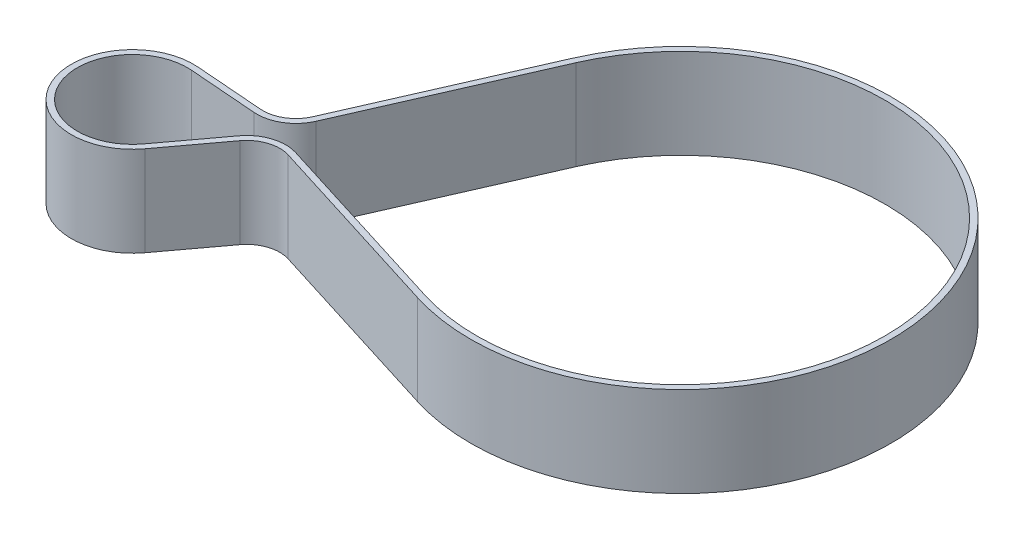
ISO-10303-21;
HEADER;
FILE_DESCRIPTION(('STEP AP214'),'2;1');
FILE_NAME('part.step','',(''),(''),'','','');
FILE_SCHEMA(('AUTOMOTIVE_DESIGN { 1 0 10303 214 1 1 1 1 }'));
ENDSEC;
DATA;
#1=APPLICATION_CONTEXT('core data for automotive mechanical design processes');
#2=APPLICATION_PROTOCOL_DEFINITION('international standard','automotive_design',2000,#1);
#3=PRODUCT_CONTEXT('',#1,'mechanical');
#4=PRODUCT('Part','Part','',(#3));
#5=PRODUCT_RELATED_PRODUCT_CATEGORY('part','',(#4));
#6=PRODUCT_DEFINITION_FORMATION('','',#4);
#7=PRODUCT_DEFINITION_CONTEXT('part definition',#1,'design');
#8=PRODUCT_DEFINITION('design','',#6,#7);
#9=PRODUCT_DEFINITION_SHAPE('','',#8);
#10=(LENGTH_UNIT() NAMED_UNIT(*) SI_UNIT(.MILLI.,.METRE.));
#11=(NAMED_UNIT(*) PLANE_ANGLE_UNIT() SI_UNIT($,.RADIAN.));
#12=(NAMED_UNIT(*) SI_UNIT($,.STERADIAN.) SOLID_ANGLE_UNIT());
#13=UNCERTAINTY_MEASURE_WITH_UNIT(LENGTH_MEASURE(1.E-05),#10,'distance_accuracy_value','');
#14=(GEOMETRIC_REPRESENTATION_CONTEXT(3) GLOBAL_UNCERTAINTY_ASSIGNED_CONTEXT((#13)) GLOBAL_UNIT_ASSIGNED_CONTEXT((#10,
#11,#12)) REPRESENTATION_CONTEXT('',''));
#15=CARTESIAN_POINT('',(0.,0.,0.));
#16=DIRECTION('',(0.,0.,1.));
#17=DIRECTION('',(1.,0.,0.));
#18=AXIS2_PLACEMENT_3D('',#15,#16,#17);
#19=CARTESIAN_POINT('',(19.3071939099942,15.,3.3299907537758));
#20=DIRECTION('',(0.,-1.,0.));
#21=DIRECTION('',(0.,0.,-1.));
#22=AXIS2_PLACEMENT_3D('',#19,#20,#21);
#23=CYLINDRICAL_SURFACE('',#22,34.);
#24=CARTESIAN_POINT('',(19.3071939099942,0.,3.3299907537758));
#25=DIRECTION('',(0.,1.,0.));
#26=DIRECTION('',(0.,0.,1.));
#27=AXIS2_PLACEMENT_3D('',#24,#25,#26);
#28=CIRCLE('',#27,34.);
#29=CARTESIAN_POINT('',(9.15831295895208,0.,35.7799555525483));
#30=VERTEX_POINT('',#29);
#31=CARTESIAN_POINT('',(-11.8287290264625,0.,-10.3284975555149));
#32=VERTEX_POINT('',#31);
#33=EDGE_CURVE('E262',#30,#32,#28,.T.);
#34=ORIENTED_EDGE('',*,*,#33,.F.);
#35=DIRECTION('',(0.,-1.,0.));
#36=VECTOR('',#35,1.);
#37=CARTESIAN_POINT('',(9.15831295895208,15.,35.7799555525483));
#38=LINE('',#37,#36);
#39=CARTESIAN_POINT('',(9.15831295895208,15.,35.7799555525483));
#40=VERTEX_POINT('',#39);
#41=EDGE_CURVE('E11',#40,#30,#38,.T.);
#42=ORIENTED_EDGE('',*,*,#41,.F.);
#43=CARTESIAN_POINT('',(19.3071939099942,15.,3.3299907537758));
#44=DIRECTION('',(0.,1.,0.));
#45=DIRECTION('',(0.,0.,1.));
#46=AXIS2_PLACEMENT_3D('',#43,#44,#45);
#47=CIRCLE('',#46,34.);
#48=CARTESIAN_POINT('',(-11.8287290264625,15.,-10.3284975555149));
#49=VERTEX_POINT('',#48);
#50=EDGE_CURVE('E309',#40,#49,#47,.T.);
#51=ORIENTED_EDGE('',*,*,#50,.T.);
#52=DIRECTION('',(0.,-1.,0.));
#53=VECTOR('',#52,1.);
#54=CARTESIAN_POINT('',(-11.8287290264625,15.,-10.3284975555149));
#55=LINE('',#54,#53);
#56=EDGE_CURVE('E121',#49,#32,#55,.T.);
#57=ORIENTED_EDGE('',*,*,#56,.T.);
#58=EDGE_LOOP('',(#34,#42,#51,#57));
#59=FACE_BOUND('',#58,.T.);
#60=ADVANCED_FACE('F43',(#59),#23,.F.);
#61=CARTESIAN_POINT('',(-9.37728216589645,15.,29.9828599487367));
#62=DIRECTION('',(0.298496498560061,0.,-0.954410729375662));
#63=DIRECTION('',(-0.954410729375662,0.,-0.298496498560061));
#64=AXIS2_PLACEMENT_3D('',#61,#62,#63);
#65=PLANE('',#64);
#66=DIRECTION('',(0.954410729375662,0.,0.298496498560061));
#67=VECTOR('',#66,1.);
#68=CARTESIAN_POINT('',(-9.37728216589645,0.,29.9828599487367));
#69=LINE('',#68,#67);
#70=CARTESIAN_POINT('',(-22.2077317202101,0.,25.9700757783205));
#71=VERTEX_POINT('',#70);
#72=EDGE_CURVE('E258',#71,#30,#69,.T.);
#73=ORIENTED_EDGE('',*,*,#72,.F.);
#74=DIRECTION('',(0.,-1.,0.));
#75=VECTOR('',#74,1.);
#76=CARTESIAN_POINT('',(-22.2077317202101,15.,25.9700757783205));
#77=LINE('',#76,#75);
#78=CARTESIAN_POINT('',(-22.2077317202101,15.,25.9700757783205));
#79=VERTEX_POINT('',#78);
#80=EDGE_CURVE('E54',#79,#71,#77,.T.);
#81=ORIENTED_EDGE('',*,*,#80,.F.);
#82=DIRECTION('',(0.954410729375662,0.,0.298496498560061));
#83=VECTOR('',#82,1.);
#84=CARTESIAN_POINT('',(-9.37728216589645,15.,29.9828599487367));
#85=LINE('',#84,#83);
#86=EDGE_CURVE('E305',#79,#40,#85,.T.);
#87=ORIENTED_EDGE('',*,*,#86,.T.);
#88=ORIENTED_EDGE('',*,*,#41,.T.);
#89=EDGE_LOOP('',(#73,#81,#87,#88));
#90=FACE_BOUND('',#89,.T.);
#91=ADVANCED_FACE('F375',(#90),#65,.T.);
#92=CARTESIAN_POINT('',(-24.1479589608505,15.,32.1737455192623));
#93=DIRECTION('',(0.,-1.,0.));
#94=DIRECTION('',(0.,0.,-1.));
#95=AXIS2_PLACEMENT_3D('',#92,#93,#94);
#96=CYLINDRICAL_SURFACE('',#95,6.5);
#97=CARTESIAN_POINT('',(-24.1479589608505,0.,32.1737455192623));
#98=DIRECTION('',(0.,1.,0.));
#99=DIRECTION('',(0.,0.,1.));
#100=AXIS2_PLACEMENT_3D('',#97,#98,#99);
#101=CIRCLE('',#100,6.5);
#102=CARTESIAN_POINT('',(-29.3660111944638,0.,28.2979319417946));
#103=VERTEX_POINT('',#102);
#104=EDGE_CURVE('E254',#71,#103,#101,.T.);
#105=ORIENTED_EDGE('',*,*,#104,.T.);
#106=DIRECTION('',(0.,-1.,0.));
#107=VECTOR('',#106,1.);
#108=CARTESIAN_POINT('',(-29.3660111944638,15.,28.2979319417946));
#109=LINE('',#108,#107);
#110=CARTESIAN_POINT('',(-29.3660111944638,15.,28.2979319417946));
#111=VERTEX_POINT('',#110);
#112=EDGE_CURVE('E204',#111,#103,#109,.T.);
#113=ORIENTED_EDGE('',*,*,#112,.F.);
#114=CARTESIAN_POINT('',(-24.1479589608505,15.,32.1737455192623));
#115=DIRECTION('',(0.,1.,0.));
#116=DIRECTION('',(0.,0.,1.));
#117=AXIS2_PLACEMENT_3D('',#114,#115,#116);
#118=CIRCLE('',#117,6.5);
#119=EDGE_CURVE('E302',#79,#111,#118,.T.);
#120=ORIENTED_EDGE('',*,*,#119,.F.);
#121=ORIENTED_EDGE('',*,*,#80,.T.);
#122=EDGE_LOOP('',(#105,#113,#120,#121));
#123=FACE_BOUND('',#122,.T.);
#124=ADVANCED_FACE('F380',(#123),#96,.T.);
#125=CARTESIAN_POINT('',(-5.37933283829392,15.,-3.99560800063889));
#126=DIRECTION('',(-0.802777266709748,0.,-0.5962790119181));
#127=DIRECTION('',(-0.5962790119181,0.,0.802777266709748));
#128=AXIS2_PLACEMENT_3D('',#125,#126,#127);
#129=PLANE('',#128);
#130=DIRECTION('',(0.5962790119181,0.,-0.802777266709748));
#131=VECTOR('',#130,1.);
#132=CARTESIAN_POINT('',(-5.37933283829392,0.,-3.99560800063889));
#133=LINE('',#132,#131);
#134=CARTESIAN_POINT('',(-36.104610406798,0.,37.3701852812649));
#135=VERTEX_POINT('',#134);
#136=EDGE_CURVE('E250',#135,#103,#133,.T.);
#137=ORIENTED_EDGE('',*,*,#136,.F.);
#138=DIRECTION('',(0.,-1.,0.));
#139=VECTOR('',#138,1.);
#140=CARTESIAN_POINT('',(-36.104610406798,15.,37.3701852812649));
#141=LINE('',#140,#139);
#142=CARTESIAN_POINT('',(-36.104610406798,15.,37.3701852812649));
#143=VERTEX_POINT('',#142);
#144=EDGE_CURVE('E197',#143,#135,#141,.T.);
#145=ORIENTED_EDGE('',*,*,#144,.F.);
#146=DIRECTION('',(0.5962790119181,0.,-0.802777266709748));
#147=VECTOR('',#146,1.);
#148=CARTESIAN_POINT('',(-5.37933283829392,15.,-3.99560800063889));
#149=LINE('',#148,#147);
#150=EDGE_CURVE('E298',#143,#111,#149,.T.);
#151=ORIENTED_EDGE('',*,*,#150,.T.);
#152=ORIENTED_EDGE('',*,*,#112,.T.);
#153=EDGE_LOOP('',(#137,#145,#151,#152));
#154=FACE_BOUND('',#153,.T.);
#155=ADVANCED_FACE('F405',(#154),#129,.T.);
#156=CARTESIAN_POINT('',(-43.4660779425263,15.,31.902306741976));
#157=DIRECTION('',(0.,-1.,0.));
#158=DIRECTION('',(0.,0.,-1.));
#159=AXIS2_PLACEMENT_3D('',#156,#157,#158);
#160=CYLINDRICAL_SURFACE('',#159,9.17);
#161=CARTESIAN_POINT('',(-43.4660779425263,0.,31.902306741976));
#162=DIRECTION('',(0.,1.,0.));
#163=DIRECTION('',(0.,0.,1.));
#164=AXIS2_PLACEMENT_3D('',#161,#162,#163);
#165=CIRCLE('',#164,9.17);
#166=CARTESIAN_POINT('',(-42.7547102206907,0.,22.7599407481902));
#167=VERTEX_POINT('',#166);
#168=EDGE_CURVE('E246',#167,#135,#165,.T.);
#169=ORIENTED_EDGE('',*,*,#168,.F.);
#170=DIRECTION('',(0.,-1.,0.));
#171=VECTOR('',#170,1.);
#172=CARTESIAN_POINT('',(-42.7547102206907,15.,22.7599407481902));
#173=LINE('',#172,#171);
#174=CARTESIAN_POINT('',(-42.7547102206907,15.,22.7599407481902));
#175=VERTEX_POINT('',#174);
#176=EDGE_CURVE('E193',#175,#167,#173,.T.);
#177=ORIENTED_EDGE('',*,*,#176,.F.);
#178=CARTESIAN_POINT('',(-43.4660779425263,15.,31.902306741976));
#179=DIRECTION('',(0.,1.,0.));
#180=DIRECTION('',(0.,0.,1.));
#181=AXIS2_PLACEMENT_3D('',#178,#179,#180);
#182=CIRCLE('',#181,9.17);
#183=EDGE_CURVE('E185',#175,#143,#182,.T.);
#184=ORIENTED_EDGE('',*,*,#183,.T.);
#185=ORIENTED_EDGE('',*,*,#144,.T.);
#186=EDGE_LOOP('',(#169,#177,#184,#185));
#187=FACE_BOUND('',#186,.T.);
#188=ADVANCED_FACE('F402',(#187),#160,.F.);
#189=CARTESIAN_POINT('',(-2.01759036174256,15.,25.9296970419005));
#190=DIRECTION('',(0.0775755421849118,0.,-0.996986476966823));
#191=DIRECTION('',(-0.996986476966823,0.,-0.0775755421849118));
#192=AXIS2_PLACEMENT_3D('',#189,#190,#191);
#193=PLANE('',#192);
#194=DIRECTION('',(0.996986476966823,0.,0.0775755421849118));
#195=VECTOR('',#194,1.);
#196=CARTESIAN_POINT('',(-2.01759036174256,0.,25.9296970419005));
#197=LINE('',#196,#195);
#198=CARTESIAN_POINT('',(-31.4876822788802,0.,23.6366284682259));
#199=VERTEX_POINT('',#198);
#200=EDGE_CURVE('E191',#167,#199,#197,.T.);
#201=ORIENTED_EDGE('',*,*,#200,.T.);
#202=DIRECTION('',(0.,-1.,0.));
#203=VECTOR('',#202,1.);
#204=CARTESIAN_POINT('',(-31.4876822788802,15.,23.6366284682259));
#205=LINE('',#204,#203);
#206=CARTESIAN_POINT('',(-31.4876822788802,15.,23.6366284682259));
#207=VERTEX_POINT('',#206);
#208=EDGE_CURVE('E174',#207,#199,#205,.T.);
#209=ORIENTED_EDGE('',*,*,#208,.F.);
#210=DIRECTION('',(0.996986476966823,0.,0.0775755421849118));
#211=VECTOR('',#210,1.);
#212=CARTESIAN_POINT('',(-2.01759036174256,15.,25.9296970419005));
#213=LINE('',#212,#211);
#214=EDGE_CURVE('E178',#175,#207,#213,.T.);
#215=ORIENTED_EDGE('',*,*,#214,.F.);
#216=ORIENTED_EDGE('',*,*,#176,.T.);
#217=EDGE_LOOP('',(#201,#209,#215,#216));
#218=FACE_BOUND('',#217,.T.);
#219=ADVANCED_FACE('F189',(#218),#193,.F.);
#220=CARTESIAN_POINT('',(-30.9834412546783,15.,17.1562163679416));
#221=DIRECTION('',(0.,-1.,0.));
#222=DIRECTION('',(0.,0.,-1.));
#223=AXIS2_PLACEMENT_3D('',#220,#221,#222);
#224=CYLINDRICAL_SURFACE('',#223,6.5);
#225=CARTESIAN_POINT('',(-30.9834412546783,0.,17.1562163679416));
#226=DIRECTION('',(0.,1.,0.));
#227=DIRECTION('',(0.,0.,1.));
#228=AXIS2_PLACEMENT_3D('',#225,#226,#227);
#229=CIRCLE('',#228,6.5);
#230=CARTESIAN_POINT('',(-25.0309853991792,0.,19.7673979564824));
#231=VERTEX_POINT('',#230);
#232=EDGE_CURVE('E241',#199,#231,#229,.T.);
#233=ORIENTED_EDGE('',*,*,#232,.T.);
#234=DIRECTION('',(0.,-1.,0.));
#235=VECTOR('',#234,1.);
#236=CARTESIAN_POINT('',(-25.0309853991792,15.,19.7673979564824));
#237=LINE('',#236,#235);
#238=CARTESIAN_POINT('',(-25.0309853991792,15.,19.7673979564824));
#239=VERTEX_POINT('',#238);
#240=EDGE_CURVE('E176',#239,#231,#237,.T.);
#241=ORIENTED_EDGE('',*,*,#240,.F.);
#242=CARTESIAN_POINT('',(-30.9834412546783,15.,17.1562163679416));
#243=DIRECTION('',(0.,1.,0.));
#244=DIRECTION('',(0.,0.,1.));
#245=AXIS2_PLACEMENT_3D('',#242,#243,#244);
#246=CIRCLE('',#245,6.5);
#247=EDGE_CURVE('E169',#207,#239,#246,.T.);
#248=ORIENTED_EDGE('',*,*,#247,.F.);
#249=ORIENTED_EDGE('',*,*,#208,.T.);
#250=EDGE_LOOP('',(#233,#241,#248,#249));
#251=FACE_BOUND('',#250,.T.);
#252=ADVANCED_FACE('F172',(#251),#224,.T.);
#253=CARTESIAN_POINT('',(-9.67577866445652,15.,30.9372706781124));
#254=DIRECTION('',(0.298496498560061,0.,-0.954410729375662));
#255=DIRECTION('',(-0.954410729375662,0.,-0.298496498560061));
#256=AXIS2_PLACEMENT_3D('',#253,#254,#255);
#257=PLANE('',#256);
#258=DIRECTION('',(0.954410729375662,0.,0.298496498560061));
#259=VECTOR('',#258,1.);
#260=CARTESIAN_POINT('',(-9.67577866445652,0.,30.9372706781124));
#261=LINE('',#260,#259);
#262=CARTESIAN_POINT('',(-22.5062282187701,0.,26.9244865076961));
#263=VERTEX_POINT('',#262);
#264=CARTESIAN_POINT('',(8.85981646039201,0.,36.734366281924));
#265=VERTEX_POINT('',#264);
#266=EDGE_CURVE('E291',#263,#265,#261,.T.);
#267=ORIENTED_EDGE('',*,*,#266,.T.);
#268=DIRECTION('',(0.,-1.,0.));
#269=VECTOR('',#268,1.);
#270=CARTESIAN_POINT('',(8.85981646039201,15.,36.734366281924));
#271=LINE('',#270,#269);
#272=CARTESIAN_POINT('',(8.85981646039201,15.,36.734366281924));
#273=VERTEX_POINT('',#272);
#274=EDGE_CURVE('E47',#273,#265,#271,.T.);
#275=ORIENTED_EDGE('',*,*,#274,.F.);
#276=DIRECTION('',(0.954410729375662,0.,0.298496498560061));
#277=VECTOR('',#276,1.);
#278=CARTESIAN_POINT('',(-9.67577866445652,15.,30.9372706781124));
#279=LINE('',#278,#277);
#280=CARTESIAN_POINT('',(-22.5062282187701,15.,26.9244865076961));
#281=VERTEX_POINT('',#280);
#282=EDGE_CURVE('E240',#281,#273,#279,.T.);
#283=ORIENTED_EDGE('',*,*,#282,.F.);
#284=DIRECTION('',(0.,-1.,0.));
#285=VECTOR('',#284,1.);
#286=CARTESIAN_POINT('',(-22.5062282187701,15.,26.9244865076961));
#287=LINE('',#286,#285);
#288=EDGE_CURVE('E209',#281,#263,#287,.T.);
#289=ORIENTED_EDGE('',*,*,#288,.T.);
#290=EDGE_LOOP('',(#267,#275,#283,#289));
#291=FACE_BOUND('',#290,.T.);
#292=ADVANCED_FACE('F45',(#291),#257,.F.);
#293=CARTESIAN_POINT('',(19.3071939099942,15.,3.3299907537758));
#294=DIRECTION('',(0.,-1.,0.));
#295=DIRECTION('',(0.,0.,-1.));
#296=AXIS2_PLACEMENT_3D('',#293,#294,#295);
#297=CYLINDRICAL_SURFACE('',#296,35.);
#298=CARTESIAN_POINT('',(19.3071939099942,0.,3.3299907537758));
#299=DIRECTION('',(0.,1.,0.));
#300=DIRECTION('',(0.,0.,1.));
#301=AXIS2_PLACEMENT_3D('',#298,#299,#300);
#302=CIRCLE('',#301,35.);
#303=CARTESIAN_POINT('',(-12.7444914657701,0.,-10.7302177999058));
#304=VERTEX_POINT('',#303);
#305=EDGE_CURVE('E288',#265,#304,#302,.T.);
#306=ORIENTED_EDGE('',*,*,#305,.T.);
#307=DIRECTION('',(0.,-1.,0.));
#308=VECTOR('',#307,1.);
#309=CARTESIAN_POINT('',(-12.7444914657701,15.,-10.7302177999058));
#310=LINE('',#309,#308);
#311=CARTESIAN_POINT('',(-12.7444914657701,15.,-10.7302177999058));
#312=VERTEX_POINT('',#311);
#313=EDGE_CURVE('E227',#312,#304,#310,.T.);
#314=ORIENTED_EDGE('',*,*,#313,.F.);
#315=CARTESIAN_POINT('',(19.3071939099942,15.,3.3299907537758));
#316=DIRECTION('',(0.,1.,0.));
#317=DIRECTION('',(0.,0.,1.));
#318=AXIS2_PLACEMENT_3D('',#315,#316,#317);
#319=CIRCLE('',#318,35.);
#320=EDGE_CURVE('E129',#273,#312,#319,.T.);
#321=ORIENTED_EDGE('',*,*,#320,.F.);
#322=ORIENTED_EDGE('',*,*,#274,.T.);
#323=EDGE_LOOP('',(#306,#314,#321,#322));
#324=FACE_BOUND('',#323,.T.);
#325=ADVANCED_FACE('F471',(#324),#297,.T.);
#326=CARTESIAN_POINT('',(-14.635232065758,15.,-6.42008096184802));
#327=DIRECTION('',(-0.915762439307549,0.,-0.401720244390903));
#328=DIRECTION('',(-0.401720244390903,0.,0.915762439307549));
#329=AXIS2_PLACEMENT_3D('',#326,#327,#328);
#330=PLANE('',#329);
#331=DIRECTION('',(0.401720244390903,0.,-0.91576243930755));
#332=VECTOR('',#331,1.);
#333=CARTESIAN_POINT('',(-14.635232065758,0.,-6.42008096184802));
#334=LINE('',#333,#332);
#335=CARTESIAN_POINT('',(-25.9467478384867,0.,19.3656777120915));
#336=VERTEX_POINT('',#335);
#337=EDGE_CURVE('E284',#336,#304,#334,.T.);
#338=ORIENTED_EDGE('',*,*,#337,.F.);
#339=DIRECTION('',(0.,-1.,0.));
#340=VECTOR('',#339,1.);
#341=CARTESIAN_POINT('',(-25.9467478384867,15.,19.3656777120915));
#342=LINE('',#341,#340);
#343=CARTESIAN_POINT('',(-25.9467478384867,15.,19.3656777120915));
#344=VERTEX_POINT('',#343);
#345=EDGE_CURVE('E225',#344,#336,#342,.T.);
#346=ORIENTED_EDGE('',*,*,#345,.F.);
#347=DIRECTION('',(0.401720244390903,0.,-0.91576243930755));
#348=VECTOR('',#347,1.);
#349=CARTESIAN_POINT('',(-14.635232065758,15.,-6.42008096184802));
#350=LINE('',#349,#348);
#351=EDGE_CURVE('E330',#344,#312,#350,.T.);
#352=ORIENTED_EDGE('',*,*,#351,.T.);
#353=ORIENTED_EDGE('',*,*,#313,.T.);
#354=EDGE_LOOP('',(#338,#346,#352,#353));
#355=FACE_BOUND('',#354,.T.);
#356=ADVANCED_FACE('F364',(#355),#330,.T.);
#357=CARTESIAN_POINT('',(-30.9834412546783,15.,17.1562163679416));
#358=DIRECTION('',(0.,-1.,0.));
#359=DIRECTION('',(0.,0.,-1.));
#360=AXIS2_PLACEMENT_3D('',#357,#358,#359);
#361=CYLINDRICAL_SURFACE('',#360,5.5);
#362=CARTESIAN_POINT('',(-30.9834412546783,0.,17.1562163679416));
#363=DIRECTION('',(0.,1.,0.));
#364=DIRECTION('',(0.,0.,1.));
#365=AXIS2_PLACEMENT_3D('',#362,#363,#364);
#366=CIRCLE('',#365,5.5);
#367=CARTESIAN_POINT('',(-31.4101067366953,0.,22.6396419912591));
#368=VERTEX_POINT('',#367);
#369=EDGE_CURVE('E280',#368,#336,#366,.T.);
#370=ORIENTED_EDGE('',*,*,#369,.F.);
#371=DIRECTION('',(0.,-1.,0.));
#372=VECTOR('',#371,1.);
#373=CARTESIAN_POINT('',(-31.4101067366953,15.,22.6396419912591));
#374=LINE('',#373,#372);
#375=CARTESIAN_POINT('',(-31.4101067366953,15.,22.6396419912591));
#376=VERTEX_POINT('',#375);
#377=EDGE_CURVE('E222',#376,#368,#374,.T.);
#378=ORIENTED_EDGE('',*,*,#377,.F.);
#379=CARTESIAN_POINT('',(-30.9834412546783,15.,17.1562163679416));
#380=DIRECTION('',(0.,1.,0.));
#381=DIRECTION('',(0.,0.,1.));
#382=AXIS2_PLACEMENT_3D('',#379,#380,#381);
#383=CIRCLE('',#382,5.5);
#384=EDGE_CURVE('E326',#376,#344,#383,.T.);
#385=ORIENTED_EDGE('',*,*,#384,.T.);
#386=ORIENTED_EDGE('',*,*,#345,.T.);
#387=EDGE_LOOP('',(#370,#378,#385,#386));
#388=FACE_BOUND('',#387,.T.);
#389=ADVANCED_FACE('F363',(#388),#361,.F.);
#390=CARTESIAN_POINT('',(-1.94001481955765,15.,24.9327105649337));
#391=DIRECTION('',(0.0775755421849119,0.,-0.996986476966823));
#392=DIRECTION('',(-0.996986476966823,0.,-0.0775755421849119));
#393=AXIS2_PLACEMENT_3D('',#390,#391,#392);
#394=PLANE('',#393);
#395=DIRECTION('',(0.996986476966823,0.,0.0775755421849119));
#396=VECTOR('',#395,1.);
#397=CARTESIAN_POINT('',(-1.94001481955765,0.,24.9327105649337));
#398=LINE('',#397,#396);
#399=CARTESIAN_POINT('',(-42.6771346785058,0.,21.7629542712234));
#400=VERTEX_POINT('',#399);
#401=EDGE_CURVE('E276',#400,#368,#398,.T.);
#402=ORIENTED_EDGE('',*,*,#401,.F.);
#403=DIRECTION('',(0.,-1.,0.));
#404=VECTOR('',#403,1.);
#405=CARTESIAN_POINT('',(-42.6771346785058,15.,21.7629542712234));
#406=LINE('',#405,#404);
#407=CARTESIAN_POINT('',(-42.6771346785058,15.,21.7629542712234));
#408=VERTEX_POINT('',#407);
#409=EDGE_CURVE('E219',#408,#400,#406,.T.);
#410=ORIENTED_EDGE('',*,*,#409,.F.);
#411=DIRECTION('',(0.996986476966823,0.,0.0775755421849119));
#412=VECTOR('',#411,1.);
#413=CARTESIAN_POINT('',(-1.94001481955765,15.,24.9327105649337));
#414=LINE('',#413,#412);
#415=EDGE_CURVE('E322',#408,#376,#414,.T.);
#416=ORIENTED_EDGE('',*,*,#415,.T.);
#417=ORIENTED_EDGE('',*,*,#377,.T.);
#418=EDGE_LOOP('',(#402,#410,#416,#417));
#419=FACE_BOUND('',#418,.T.);
#420=ADVANCED_FACE('F357',(#419),#394,.T.);
#421=CARTESIAN_POINT('',(-43.4660779425263,15.,31.902306741976));
#422=DIRECTION('',(0.,-1.,0.));
#423=DIRECTION('',(0.,0.,-1.));
#424=AXIS2_PLACEMENT_3D('',#421,#422,#423);
#425=CYLINDRICAL_SURFACE('',#424,10.17);
#426=CARTESIAN_POINT('',(-43.4660779425263,0.,31.902306741976));
#427=DIRECTION('',(0.,1.,0.));
#428=DIRECTION('',(0.,0.,1.));
#429=AXIS2_PLACEMENT_3D('',#426,#427,#428);
#430=CIRCLE('',#429,10.17);
#431=CARTESIAN_POINT('',(-35.3018331400882,0.,37.966464293183));
#432=VERTEX_POINT('',#431);
#433=EDGE_CURVE('E273',#400,#432,#430,.T.);
#434=ORIENTED_EDGE('',*,*,#433,.T.);
#435=DIRECTION('',(0.,-1.,0.));
#436=VECTOR('',#435,1.);
#437=CARTESIAN_POINT('',(-35.3018331400882,15.,37.966464293183));
#438=LINE('',#437,#436);
#439=CARTESIAN_POINT('',(-35.3018331400882,15.,37.966464293183));
#440=VERTEX_POINT('',#439);
#441=EDGE_CURVE('E215',#440,#432,#438,.T.);
#442=ORIENTED_EDGE('',*,*,#441,.F.);
#443=CARTESIAN_POINT('',(-43.4660779425263,15.,31.902306741976));
#444=DIRECTION('',(0.,1.,0.));
#445=DIRECTION('',(0.,0.,1.));
#446=AXIS2_PLACEMENT_3D('',#443,#444,#445);
#447=CIRCLE('',#446,10.17);
#448=EDGE_CURVE('E319',#408,#440,#447,.T.);
#449=ORIENTED_EDGE('',*,*,#448,.F.);
#450=ORIENTED_EDGE('',*,*,#409,.T.);
#451=EDGE_LOOP('',(#434,#442,#449,#450));
#452=FACE_BOUND('',#451,.T.);
#453=ADVANCED_FACE('F365',(#452),#425,.T.);
#454=CARTESIAN_POINT('',(-4.57655557158416,15.,-3.39932898872078));
#455=DIRECTION('',(-0.802777266709748,0.,-0.596279011918101));
#456=DIRECTION('',(-0.5962790119181,0.,0.802777266709748));
#457=AXIS2_PLACEMENT_3D('',#454,#455,#456);
#458=PLANE('',#457);
#459=DIRECTION('',(0.596279011918101,0.,-0.802777266709748));
#460=VECTOR('',#459,1.);
#461=CARTESIAN_POINT('',(-4.57655557158416,0.,-3.39932898872078));
#462=LINE('',#461,#460);
#463=CARTESIAN_POINT('',(-28.5632339277541,0.,28.8942109537127));
#464=VERTEX_POINT('',#463);
#465=EDGE_CURVE('E269',#432,#464,#462,.T.);
#466=ORIENTED_EDGE('',*,*,#465,.T.);
#467=DIRECTION('',(0.,-1.,0.));
#468=VECTOR('',#467,1.);
#469=CARTESIAN_POINT('',(-28.5632339277541,15.,28.8942109537127));
#470=LINE('',#469,#468);
#471=CARTESIAN_POINT('',(-28.5632339277541,15.,28.8942109537127));
#472=VERTEX_POINT('',#471);
#473=EDGE_CURVE('E212',#472,#464,#470,.T.);
#474=ORIENTED_EDGE('',*,*,#473,.F.);
#475=DIRECTION('',(0.596279011918101,0.,-0.802777266709748));
#476=VECTOR('',#475,1.);
#477=CARTESIAN_POINT('',(-4.57655557158416,15.,-3.39932898872078));
#478=LINE('',#477,#476);
#479=EDGE_CURVE('E316',#440,#472,#478,.T.);
#480=ORIENTED_EDGE('',*,*,#479,.F.);
#481=ORIENTED_EDGE('',*,*,#441,.T.);
#482=EDGE_LOOP('',(#466,#474,#480,#481));
#483=FACE_BOUND('',#482,.T.);
#484=ADVANCED_FACE('F351',(#483),#458,.F.);
#485=CARTESIAN_POINT('',(-24.1479589608505,15.,32.1737455192623));
#486=DIRECTION('',(0.,-1.,0.));
#487=DIRECTION('',(0.,0.,-1.));
#488=AXIS2_PLACEMENT_3D('',#485,#486,#487);
#489=CYLINDRICAL_SURFACE('',#488,5.5);
#490=CARTESIAN_POINT('',(-24.1479589608505,0.,32.1737455192623));
#491=DIRECTION('',(0.,1.,0.));
#492=DIRECTION('',(0.,0.,1.));
#493=AXIS2_PLACEMENT_3D('',#490,#491,#492);
#494=CIRCLE('',#493,5.5);
#495=EDGE_CURVE('E265',#263,#464,#494,.T.);
#496=ORIENTED_EDGE('',*,*,#495,.F.);
#497=ORIENTED_EDGE('',*,*,#288,.F.);
#498=CARTESIAN_POINT('',(-24.1479589608505,15.,32.1737455192623));
#499=DIRECTION('',(0.,1.,0.));
#500=DIRECTION('',(0.,0.,1.));
#501=AXIS2_PLACEMENT_3D('',#498,#499,#500);
#502=CIRCLE('',#501,5.5);
#503=EDGE_CURVE('E312',#281,#472,#502,.T.);
#504=ORIENTED_EDGE('',*,*,#503,.T.);
#505=ORIENTED_EDGE('',*,*,#473,.T.);
#506=EDGE_LOOP('',(#496,#497,#504,#505));
#507=FACE_BOUND('',#506,.T.);
#508=ADVANCED_FACE('F347',(#507),#489,.F.);
#509=CARTESIAN_POINT('',(-13.7194696264505,15.,-6.01836071745712));
#510=DIRECTION('',(-0.915762439307549,0.,-0.401720244390904));
#511=DIRECTION('',(-0.401720244390904,0.,0.915762439307549));
#512=AXIS2_PLACEMENT_3D('',#509,#510,#511);
#513=PLANE('',#512);
#514=DIRECTION('',(0.401720244390904,0.,-0.915762439307549));
#515=VECTOR('',#514,1.);
#516=CARTESIAN_POINT('',(-13.7194696264505,0.,-6.01836071745712));
#517=LINE('',#516,#515);
#518=EDGE_CURVE('E114',#231,#32,#517,.T.);
#519=ORIENTED_EDGE('',*,*,#518,.T.);
#520=ORIENTED_EDGE('',*,*,#56,.F.);
#521=DIRECTION('',(0.401720244390904,0.,-0.915762439307549));
#522=VECTOR('',#521,1.);
#523=CARTESIAN_POINT('',(-13.7194696264505,15.,-6.01836071745712));
#524=LINE('',#523,#522);
#525=EDGE_CURVE('E63',#239,#49,#524,.T.);
#526=ORIENTED_EDGE('',*,*,#525,.F.);
#527=ORIENTED_EDGE('',*,*,#240,.T.);
#528=EDGE_LOOP('',(#519,#520,#526,#527));
#529=FACE_BOUND('',#528,.T.);
#530=ADVANCED_FACE('F386',(#529),#513,.F.);
#531=CARTESIAN_POINT('',(0.,15.,0.));
#532=DIRECTION('',(0.,1.,0.));
#533=DIRECTION('',(0.,0.,1.));
#534=AXIS2_PLACEMENT_3D('',#531,#532,#533);
#535=PLANE('',#534);
#536=ORIENTED_EDGE('',*,*,#282,.T.);
#537=ORIENTED_EDGE('',*,*,#320,.T.);
#538=ORIENTED_EDGE('',*,*,#351,.F.);
#539=ORIENTED_EDGE('',*,*,#384,.F.);
#540=ORIENTED_EDGE('',*,*,#415,.F.);
#541=ORIENTED_EDGE('',*,*,#448,.T.);
#542=ORIENTED_EDGE('',*,*,#479,.T.);
#543=ORIENTED_EDGE('',*,*,#503,.F.);
#544=EDGE_LOOP('',(#536,#537,#538,#539,#540,#541,#542,#543));
#545=FACE_BOUND('',#544,.T.);
#546=ORIENTED_EDGE('',*,*,#50,.F.);
#547=ORIENTED_EDGE('',*,*,#86,.F.);
#548=ORIENTED_EDGE('',*,*,#119,.T.);
#549=ORIENTED_EDGE('',*,*,#150,.F.);
#550=ORIENTED_EDGE('',*,*,#183,.F.);
#551=ORIENTED_EDGE('',*,*,#214,.T.);
#552=ORIENTED_EDGE('',*,*,#247,.T.);
#553=ORIENTED_EDGE('',*,*,#525,.T.);
#554=EDGE_LOOP('',(#546,#547,#548,#549,#550,#551,#552,#553));
#555=FACE_BOUND('',#554,.T.);
#556=ADVANCED_FACE('F182',(#545,#555),#535,.T.);
#557=CARTESIAN_POINT('',(0.,0.,0.));
#558=DIRECTION('',(0.,1.,0.));
#559=DIRECTION('',(0.,0.,1.));
#560=AXIS2_PLACEMENT_3D('',#557,#558,#559);
#561=PLANE('',#560);
#562=ORIENTED_EDGE('',*,*,#266,.F.);
#563=ORIENTED_EDGE('',*,*,#495,.T.);
#564=ORIENTED_EDGE('',*,*,#465,.F.);
#565=ORIENTED_EDGE('',*,*,#433,.F.);
#566=ORIENTED_EDGE('',*,*,#401,.T.);
#567=ORIENTED_EDGE('',*,*,#369,.T.);
#568=ORIENTED_EDGE('',*,*,#337,.T.);
#569=ORIENTED_EDGE('',*,*,#305,.F.);
#570=EDGE_LOOP('',(#562,#563,#564,#565,#566,#567,#568,#569));
#571=FACE_BOUND('',#570,.T.);
#572=ORIENTED_EDGE('',*,*,#33,.T.);
#573=ORIENTED_EDGE('',*,*,#518,.F.);
#574=ORIENTED_EDGE('',*,*,#232,.F.);
#575=ORIENTED_EDGE('',*,*,#200,.F.);
#576=ORIENTED_EDGE('',*,*,#168,.T.);
#577=ORIENTED_EDGE('',*,*,#136,.T.);
#578=ORIENTED_EDGE('',*,*,#104,.F.);
#579=ORIENTED_EDGE('',*,*,#72,.T.);
#580=EDGE_LOOP('',(#572,#573,#574,#575,#576,#577,#578,#579));
#581=FACE_BOUND('',#580,.T.);
#582=ADVANCED_FACE('F344',(#571,#581),#561,.F.);
#583=CLOSED_SHELL('',(#60,#91,#124,#155,#188,#219,#252,#292,#325,#356,#389,#420,#453,#484,#508,
#530,#556,#582));
#584=MANIFOLD_SOLID_BREP('B2',#583);
#585=ADVANCED_BREP_SHAPE_REPRESENTATION('',(#18,#584),#14);
#586=SHAPE_DEFINITION_REPRESENTATION(#9,#585);
ENDSEC;
END-ISO-10303-21;
